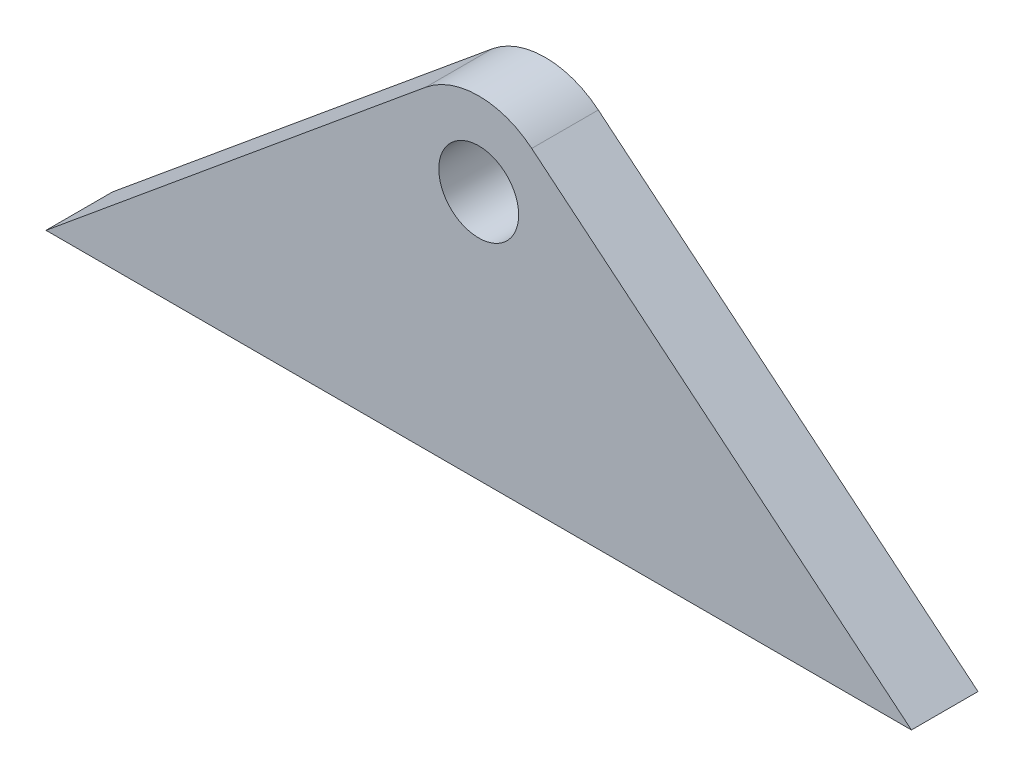
ISO-10303-21;
HEADER;
FILE_DESCRIPTION(('STEP AP214'),'2;1');
FILE_NAME('part.step','',(''),(''),'','','');
FILE_SCHEMA(('AUTOMOTIVE_DESIGN { 1 0 10303 214 1 1 1 1 }'));
ENDSEC;
DATA;
#1=APPLICATION_CONTEXT('core data for automotive mechanical design processes');
#2=APPLICATION_PROTOCOL_DEFINITION('international standard','automotive_design',2000,#1);
#3=PRODUCT_CONTEXT('',#1,'mechanical');
#4=PRODUCT('Part','Part','',(#3));
#5=PRODUCT_RELATED_PRODUCT_CATEGORY('part','',(#4));
#6=PRODUCT_DEFINITION_FORMATION('','',#4);
#7=PRODUCT_DEFINITION_CONTEXT('part definition',#1,'design');
#8=PRODUCT_DEFINITION('design','',#6,#7);
#9=PRODUCT_DEFINITION_SHAPE('','',#8);
#10=(LENGTH_UNIT() NAMED_UNIT(*) SI_UNIT(.MILLI.,.METRE.));
#11=(NAMED_UNIT(*) PLANE_ANGLE_UNIT() SI_UNIT($,.RADIAN.));
#12=(NAMED_UNIT(*) SI_UNIT($,.STERADIAN.) SOLID_ANGLE_UNIT());
#13=UNCERTAINTY_MEASURE_WITH_UNIT(LENGTH_MEASURE(1.E-05),#10,'distance_accuracy_value','');
#14=(GEOMETRIC_REPRESENTATION_CONTEXT(3) GLOBAL_UNCERTAINTY_ASSIGNED_CONTEXT((#13)) GLOBAL_UNIT_ASSIGNED_CONTEXT((#10,
#11,#12)) REPRESENTATION_CONTEXT('',''));
#15=CARTESIAN_POINT('',(0.,0.,0.));
#16=DIRECTION('',(0.,0.,1.));
#17=DIRECTION('',(1.,0.,0.));
#18=AXIS2_PLACEMENT_3D('',#15,#16,#17);
#19=CARTESIAN_POINT('',(-52.7540981929882,63.836023442356,10.));
#20=DIRECTION('',(-0.637024925203621,0.770843203686276,0.));
#21=DIRECTION('',(-0.770843203686276,-0.637024925203621,0.));
#22=AXIS2_PLACEMENT_3D('',#19,#20,#21);
#23=PLANE('',#22);
#24=DIRECTION('',(0.770843203686276,0.637024925203621,0.));
#25=VECTOR('',#24,1.);
#26=CARTESIAN_POINT('',(-52.7540981929882,63.836023442356,-10.));
#27=LINE('',#26,#25);
#28=CARTESIAN_POINT('',(-130.,0.,-10.));
#29=VERTEX_POINT('',#28);
#30=CARTESIAN_POINT('',(-15.9256231300905,94.2710800921569,-10.));
#31=VERTEX_POINT('',#30);
#32=EDGE_CURVE('E112',#29,#31,#27,.T.);
#33=ORIENTED_EDGE('',*,*,#32,.F.);
#34=DIRECTION('',(0.,0.,-1.));
#35=VECTOR('',#34,1.);
#36=CARTESIAN_POINT('',(-130.,0.,10.));
#37=LINE('',#36,#35);
#38=CARTESIAN_POINT('',(-130.,0.,10.));
#39=VERTEX_POINT('',#38);
#40=EDGE_CURVE('E11',#39,#29,#37,.T.);
#41=ORIENTED_EDGE('',*,*,#40,.F.);
#42=DIRECTION('',(0.770843203686276,0.637024925203621,0.));
#43=VECTOR('',#42,1.);
#44=CARTESIAN_POINT('',(-52.7540981929882,63.836023442356,10.));
#45=LINE('',#44,#43);
#46=CARTESIAN_POINT('',(-15.9256231300905,94.2710800921569,10.));
#47=VERTEX_POINT('',#46);
#48=EDGE_CURVE('E102',#39,#47,#45,.T.);
#49=ORIENTED_EDGE('',*,*,#48,.T.);
#50=DIRECTION('',(0.,0.,-1.));
#51=VECTOR('',#50,1.);
#52=CARTESIAN_POINT('',(-15.9256231300905,94.2710800921569,10.));
#53=LINE('',#52,#51);
#54=EDGE_CURVE('E81',#47,#31,#53,.T.);
#55=ORIENTED_EDGE('',*,*,#54,.T.);
#56=EDGE_LOOP('',(#33,#41,#49,#55));
#57=FACE_BOUND('',#56,.T.);
#58=ADVANCED_FACE('F41',(#57),#23,.T.);
#59=CARTESIAN_POINT('',(0.,0.,10.));
#60=DIRECTION('',(0.,-1.,0.));
#61=DIRECTION('',(0.,0.,-1.));
#62=AXIS2_PLACEMENT_3D('',#59,#60,#61);
#63=PLANE('',#62);
#64=DIRECTION('',(-1.,0.,0.));
#65=VECTOR('',#64,1.);
#66=CARTESIAN_POINT('',(0.,0.,-10.));
#67=LINE('',#66,#65);
#68=CARTESIAN_POINT('',(130.,0.,-10.));
#69=VERTEX_POINT('',#68);
#70=EDGE_CURVE('E93',#69,#29,#67,.T.);
#71=ORIENTED_EDGE('',*,*,#70,.F.);
#72=DIRECTION('',(0.,0.,-1.));
#73=VECTOR('',#72,1.);
#74=CARTESIAN_POINT('',(130.,0.,10.));
#75=LINE('',#74,#73);
#76=CARTESIAN_POINT('',(130.,0.,10.));
#77=VERTEX_POINT('',#76);
#78=EDGE_CURVE('E50',#77,#69,#75,.T.);
#79=ORIENTED_EDGE('',*,*,#78,.F.);
#80=DIRECTION('',(-1.,0.,0.));
#81=VECTOR('',#80,1.);
#82=CARTESIAN_POINT('',(0.,0.,10.));
#83=LINE('',#82,#81);
#84=EDGE_CURVE('E91',#77,#39,#83,.T.);
#85=ORIENTED_EDGE('',*,*,#84,.T.);
#86=ORIENTED_EDGE('',*,*,#40,.T.);
#87=EDGE_LOOP('',(#71,#79,#85,#86));
#88=FACE_BOUND('',#87,.T.);
#89=ADVANCED_FACE('F89',(#88),#63,.T.);
#90=CARTESIAN_POINT('',(52.7540981929882,63.836023442356,10.));
#91=DIRECTION('',(-0.637024925203621,-0.770843203686276,0.));
#92=DIRECTION('',(0.770843203686276,-0.637024925203621,0.));
#93=AXIS2_PLACEMENT_3D('',#90,#91,#92);
#94=PLANE('',#93);
#95=DIRECTION('',(-0.770843203686276,0.637024925203621,0.));
#96=VECTOR('',#95,1.);
#97=CARTESIAN_POINT('',(52.7540981929882,63.836023442356,-10.));
#98=LINE('',#97,#96);
#99=CARTESIAN_POINT('',(15.9256231300905,94.2710800921569,-10.));
#100=VERTEX_POINT('',#99);
#101=EDGE_CURVE('E115',#69,#100,#98,.T.);
#102=ORIENTED_EDGE('',*,*,#101,.T.);
#103=DIRECTION('',(0.,0.,-1.));
#104=VECTOR('',#103,1.);
#105=CARTESIAN_POINT('',(15.9256231300905,94.2710800921569,10.));
#106=LINE('',#105,#104);
#107=CARTESIAN_POINT('',(15.9256231300905,94.2710800921569,10.));
#108=VERTEX_POINT('',#107);
#109=EDGE_CURVE('E96',#108,#100,#106,.T.);
#110=ORIENTED_EDGE('',*,*,#109,.F.);
#111=DIRECTION('',(-0.770843203686276,0.637024925203621,0.));
#112=VECTOR('',#111,1.);
#113=CARTESIAN_POINT('',(52.7540981929882,63.836023442356,10.));
#114=LINE('',#113,#112);
#115=EDGE_CURVE('E98',#77,#108,#114,.T.);
#116=ORIENTED_EDGE('',*,*,#115,.F.);
#117=ORIENTED_EDGE('',*,*,#78,.T.);
#118=EDGE_LOOP('',(#102,#110,#116,#117));
#119=FACE_BOUND('',#118,.T.);
#120=ADVANCED_FACE('F99',(#119),#94,.F.);
#121=CARTESIAN_POINT('',(0.,75.,10.));
#122=DIRECTION('',(0.,0.,-1.));
#123=DIRECTION('',(-1.,0.,0.));
#124=AXIS2_PLACEMENT_3D('',#121,#122,#123);
#125=CYLINDRICAL_SURFACE('',#124,12.);
#126=CARTESIAN_POINT('',(0.,75.,10.));
#127=DIRECTION('',(0.,0.,1.));
#128=DIRECTION('',(1.,0.,0.));
#129=AXIS2_PLACEMENT_3D('',#126,#127,#128);
#130=CIRCLE('',#129,12.);
#131=CARTESIAN_POINT('',(12.,75.,10.));
#132=VERTEX_POINT('',#131);
#133=EDGE_CURVE('E104',#132,#132,#130,.T.);
#134=ORIENTED_EDGE('',*,*,#133,.T.);
#135=EDGE_LOOP('',(#134));
#136=FACE_BOUND('',#135,.T.);
#137=CARTESIAN_POINT('',(0.,75.,-10.));
#138=DIRECTION('',(0.,0.,1.));
#139=DIRECTION('',(1.,0.,0.));
#140=AXIS2_PLACEMENT_3D('',#137,#138,#139);
#141=CIRCLE('',#140,12.);
#142=CARTESIAN_POINT('',(12.,75.,-10.));
#143=VERTEX_POINT('',#142);
#144=EDGE_CURVE('E109',#143,#143,#141,.T.);
#145=ORIENTED_EDGE('',*,*,#144,.F.);
#146=EDGE_LOOP('',(#145));
#147=FACE_BOUND('',#146,.T.);
#148=ADVANCED_FACE('F43',(#136,#147),#125,.F.);
#149=CARTESIAN_POINT('',(0.,75.,10.));
#150=DIRECTION('',(0.,0.,-1.));
#151=DIRECTION('',(-1.,0.,0.));
#152=AXIS2_PLACEMENT_3D('',#149,#150,#151);
#153=CYLINDRICAL_SURFACE('',#152,25.);
#154=CARTESIAN_POINT('',(0.,75.,-10.));
#155=DIRECTION('',(0.,0.,1.));
#156=DIRECTION('',(1.,0.,0.));
#157=AXIS2_PLACEMENT_3D('',#154,#155,#156);
#158=CIRCLE('',#157,25.);
#159=EDGE_CURVE('E74',#100,#31,#158,.T.);
#160=ORIENTED_EDGE('',*,*,#159,.T.);
#161=ORIENTED_EDGE('',*,*,#54,.F.);
#162=CARTESIAN_POINT('',(0.,75.,10.));
#163=DIRECTION('',(0.,0.,1.));
#164=DIRECTION('',(1.,0.,0.));
#165=AXIS2_PLACEMENT_3D('',#162,#163,#164);
#166=CIRCLE('',#165,25.);
#167=EDGE_CURVE('E58',#108,#47,#166,.T.);
#168=ORIENTED_EDGE('',*,*,#167,.F.);
#169=ORIENTED_EDGE('',*,*,#109,.T.);
#170=EDGE_LOOP('',(#160,#161,#168,#169));
#171=FACE_BOUND('',#170,.T.);
#172=ADVANCED_FACE('F120',(#171),#153,.T.);
#173=CARTESIAN_POINT('',(0.,0.,10.));
#174=DIRECTION('',(0.,0.,1.));
#175=DIRECTION('',(1.,0.,0.));
#176=AXIS2_PLACEMENT_3D('',#173,#174,#175);
#177=PLANE('',#176);
#178=ORIENTED_EDGE('',*,*,#133,.F.);
#179=EDGE_LOOP('',(#178));
#180=FACE_BOUND('',#179,.T.);
#181=ORIENTED_EDGE('',*,*,#48,.F.);
#182=ORIENTED_EDGE('',*,*,#84,.F.);
#183=ORIENTED_EDGE('',*,*,#115,.T.);
#184=ORIENTED_EDGE('',*,*,#167,.T.);
#185=EDGE_LOOP('',(#181,#182,#183,#184));
#186=FACE_BOUND('',#185,.T.);
#187=ADVANCED_FACE('F101',(#180,#186),#177,.T.);
#188=CARTESIAN_POINT('',(0.,0.,-10.));
#189=DIRECTION('',(0.,0.,1.));
#190=DIRECTION('',(1.,0.,0.));
#191=AXIS2_PLACEMENT_3D('',#188,#189,#190);
#192=PLANE('',#191);
#193=ORIENTED_EDGE('',*,*,#144,.T.);
#194=EDGE_LOOP('',(#193));
#195=FACE_BOUND('',#194,.T.);
#196=ORIENTED_EDGE('',*,*,#32,.T.);
#197=ORIENTED_EDGE('',*,*,#159,.F.);
#198=ORIENTED_EDGE('',*,*,#101,.F.);
#199=ORIENTED_EDGE('',*,*,#70,.T.);
#200=EDGE_LOOP('',(#196,#197,#198,#199));
#201=FACE_BOUND('',#200,.T.);
#202=ADVANCED_FACE('F121',(#195,#201),#192,.F.);
#203=CLOSED_SHELL('',(#58,#89,#120,#148,#172,#187,#202));
#204=MANIFOLD_SOLID_BREP('B2',#203);
#205=ADVANCED_BREP_SHAPE_REPRESENTATION('',(#18,#204),#14);
#206=SHAPE_DEFINITION_REPRESENTATION(#9,#205);
ENDSEC;
END-ISO-10303-21;
